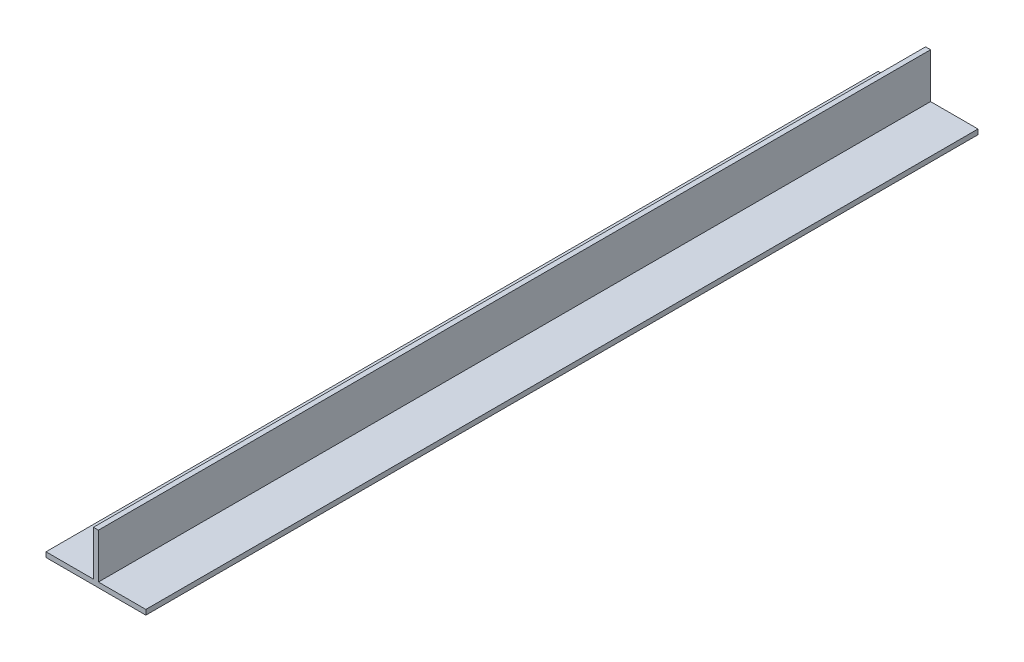
ISO-10303-21;
HEADER;
FILE_DESCRIPTION(('STEP AP214'),'2;1');
FILE_NAME('part.step','',(''),(''),'','','');
FILE_SCHEMA(('AUTOMOTIVE_DESIGN { 1 0 10303 214 1 1 1 1 }'));
ENDSEC;
DATA;
#1=APPLICATION_CONTEXT('core data for automotive mechanical design processes');
#2=APPLICATION_PROTOCOL_DEFINITION('international standard','automotive_design',2000,#1);
#3=PRODUCT_CONTEXT('',#1,'mechanical');
#4=PRODUCT('Part','Part','',(#3));
#5=PRODUCT_RELATED_PRODUCT_CATEGORY('part','',(#4));
#6=PRODUCT_DEFINITION_FORMATION('','',#4);
#7=PRODUCT_DEFINITION_CONTEXT('part definition',#1,'design');
#8=PRODUCT_DEFINITION('design','',#6,#7);
#9=PRODUCT_DEFINITION_SHAPE('','',#8);
#10=(LENGTH_UNIT() NAMED_UNIT(*) SI_UNIT(.MILLI.,.METRE.));
#11=(NAMED_UNIT(*) PLANE_ANGLE_UNIT() SI_UNIT($,.RADIAN.));
#12=(NAMED_UNIT(*) SI_UNIT($,.STERADIAN.) SOLID_ANGLE_UNIT());
#13=UNCERTAINTY_MEASURE_WITH_UNIT(LENGTH_MEASURE(1.E-05),#10,'distance_accuracy_value','');
#14=(GEOMETRIC_REPRESENTATION_CONTEXT(3) GLOBAL_UNCERTAINTY_ASSIGNED_CONTEXT((#13)) GLOBAL_UNIT_ASSIGNED_CONTEXT((#10,
#11,#12)) REPRESENTATION_CONTEXT('',''));
#15=CARTESIAN_POINT('',(0.,0.,0.));
#16=DIRECTION('',(0.,0.,1.));
#17=DIRECTION('',(1.,0.,0.));
#18=AXIS2_PLACEMENT_3D('',#15,#16,#17);
#19=CARTESIAN_POINT('',(0.,3.,500.));
#20=DIRECTION('',(1.,0.,0.));
#21=DIRECTION('',(0.,1.,0.));
#22=AXIS2_PLACEMENT_3D('',#19,#20,#21);
#23=PLANE('',#22);
#24=DIRECTION('',(0.,-1.,0.));
#25=VECTOR('',#24,1.);
#26=CARTESIAN_POINT('',(0.,3.,0.));
#27=LINE('',#26,#25);
#28=CARTESIAN_POINT('',(0.,3.,0.));
#29=VERTEX_POINT('',#28);
#30=CARTESIAN_POINT('',(0.,0.,0.));
#31=VERTEX_POINT('',#30);
#32=EDGE_CURVE('E131',#29,#31,#27,.T.);
#33=ORIENTED_EDGE('',*,*,#32,.T.);
#34=DIRECTION('',(0.,0.,-1.));
#35=VECTOR('',#34,1.);
#36=CARTESIAN_POINT('',(0.,0.,500.));
#37=LINE('',#36,#35);
#38=CARTESIAN_POINT('',(0.,0.,500.));
#39=VERTEX_POINT('',#38);
#40=EDGE_CURVE('E11',#39,#31,#37,.T.);
#41=ORIENTED_EDGE('',*,*,#40,.F.);
#42=DIRECTION('',(0.,-1.,0.));
#43=VECTOR('',#42,1.);
#44=CARTESIAN_POINT('',(0.,3.,500.));
#45=LINE('',#44,#43);
#46=CARTESIAN_POINT('',(0.,3.,500.));
#47=VERTEX_POINT('',#46);
#48=EDGE_CURVE('E145',#47,#39,#45,.T.);
#49=ORIENTED_EDGE('',*,*,#48,.F.);
#50=DIRECTION('',(0.,0.,-1.));
#51=VECTOR('',#50,1.);
#52=CARTESIAN_POINT('',(0.,3.,500.));
#53=LINE('',#52,#51);
#54=EDGE_CURVE('E127',#47,#29,#53,.T.);
#55=ORIENTED_EDGE('',*,*,#54,.T.);
#56=EDGE_LOOP('',(#33,#41,#49,#55));
#57=FACE_BOUND('',#56,.T.);
#58=ADVANCED_FACE('F35',(#57),#23,.F.);
#59=CARTESIAN_POINT('',(0.,0.,500.));
#60=DIRECTION('',(0.,1.,0.));
#61=DIRECTION('',(0.,0.,1.));
#62=AXIS2_PLACEMENT_3D('',#59,#60,#61);
#63=PLANE('',#62);
#64=DIRECTION('',(1.,0.,0.));
#65=VECTOR('',#64,1.);
#66=CARTESIAN_POINT('',(0.,0.,0.));
#67=LINE('',#66,#65);
#68=CARTESIAN_POINT('',(60.,0.,0.));
#69=VERTEX_POINT('',#68);
#70=EDGE_CURVE('E134',#31,#69,#67,.T.);
#71=ORIENTED_EDGE('',*,*,#70,.T.);
#72=DIRECTION('',(0.,0.,-1.));
#73=VECTOR('',#72,1.);
#74=CARTESIAN_POINT('',(60.,0.,500.));
#75=LINE('',#74,#73);
#76=CARTESIAN_POINT('',(60.,0.,500.));
#77=VERTEX_POINT('',#76);
#78=EDGE_CURVE('E43',#77,#69,#75,.T.);
#79=ORIENTED_EDGE('',*,*,#78,.F.);
#80=DIRECTION('',(1.,0.,0.));
#81=VECTOR('',#80,1.);
#82=CARTESIAN_POINT('',(0.,0.,500.));
#83=LINE('',#82,#81);
#84=EDGE_CURVE('E94',#39,#77,#83,.T.);
#85=ORIENTED_EDGE('',*,*,#84,.F.);
#86=ORIENTED_EDGE('',*,*,#40,.T.);
#87=EDGE_LOOP('',(#71,#79,#85,#86));
#88=FACE_BOUND('',#87,.T.);
#89=ADVANCED_FACE('F180',(#88),#63,.F.);
#90=CARTESIAN_POINT('',(60.,0.,500.));
#91=DIRECTION('',(-1.,0.,0.));
#92=DIRECTION('',(0.,0.,1.));
#93=AXIS2_PLACEMENT_3D('',#90,#91,#92);
#94=PLANE('',#93);
#95=DIRECTION('',(0.,1.,0.));
#96=VECTOR('',#95,1.);
#97=CARTESIAN_POINT('',(60.,0.,0.));
#98=LINE('',#97,#96);
#99=CARTESIAN_POINT('',(60.,3.,0.));
#100=VERTEX_POINT('',#99);
#101=EDGE_CURVE('E136',#69,#100,#98,.T.);
#102=ORIENTED_EDGE('',*,*,#101,.T.);
#103=DIRECTION('',(0.,0.,-1.));
#104=VECTOR('',#103,1.);
#105=CARTESIAN_POINT('',(60.,3.,500.));
#106=LINE('',#105,#104);
#107=CARTESIAN_POINT('',(60.,3.,500.));
#108=VERTEX_POINT('',#107);
#109=EDGE_CURVE('E152',#108,#100,#106,.T.);
#110=ORIENTED_EDGE('',*,*,#109,.F.);
#111=DIRECTION('',(0.,1.,0.));
#112=VECTOR('',#111,1.);
#113=CARTESIAN_POINT('',(60.,0.,500.));
#114=LINE('',#113,#112);
#115=EDGE_CURVE('E160',#77,#108,#114,.T.);
#116=ORIENTED_EDGE('',*,*,#115,.F.);
#117=ORIENTED_EDGE('',*,*,#78,.T.);
#118=EDGE_LOOP('',(#102,#110,#116,#117));
#119=FACE_BOUND('',#118,.T.);
#120=ADVANCED_FACE('F158',(#119),#94,.F.);
#121=CARTESIAN_POINT('',(60.,3.,500.));
#122=DIRECTION('',(0.,-1.,0.));
#123=DIRECTION('',(1.,0.,0.));
#124=AXIS2_PLACEMENT_3D('',#121,#122,#123);
#125=PLANE('',#124);
#126=DIRECTION('',(-1.,0.,0.));
#127=VECTOR('',#126,1.);
#128=CARTESIAN_POINT('',(60.,3.,0.));
#129=LINE('',#128,#127);
#130=CARTESIAN_POINT('',(31.5,3.,0.));
#131=VERTEX_POINT('',#130);
#132=EDGE_CURVE('E138',#100,#131,#129,.T.);
#133=ORIENTED_EDGE('',*,*,#132,.T.);
#134=DIRECTION('',(0.,0.,-1.));
#135=VECTOR('',#134,1.);
#136=CARTESIAN_POINT('',(31.5,3.,500.));
#137=LINE('',#136,#135);
#138=CARTESIAN_POINT('',(31.5,3.,500.));
#139=VERTEX_POINT('',#138);
#140=EDGE_CURVE('E149',#139,#131,#137,.T.);
#141=ORIENTED_EDGE('',*,*,#140,.F.);
#142=DIRECTION('',(-1.,0.,0.));
#143=VECTOR('',#142,1.);
#144=CARTESIAN_POINT('',(60.,3.,500.));
#145=LINE('',#144,#143);
#146=EDGE_CURVE('E172',#108,#139,#145,.T.);
#147=ORIENTED_EDGE('',*,*,#146,.F.);
#148=ORIENTED_EDGE('',*,*,#109,.T.);
#149=EDGE_LOOP('',(#133,#141,#147,#148));
#150=FACE_BOUND('',#149,.T.);
#151=ADVANCED_FACE('F168',(#150),#125,.F.);
#152=CARTESIAN_POINT('',(31.5,3.,500.));
#153=DIRECTION('',(-1.,0.,0.));
#154=DIRECTION('',(0.,0.,1.));
#155=AXIS2_PLACEMENT_3D('',#152,#153,#154);
#156=PLANE('',#155);
#157=DIRECTION('',(0.,1.,0.));
#158=VECTOR('',#157,1.);
#159=CARTESIAN_POINT('',(31.5,3.,0.));
#160=LINE('',#159,#158);
#161=CARTESIAN_POINT('',(31.5,30.,0.));
#162=VERTEX_POINT('',#161);
#163=EDGE_CURVE('E140',#131,#162,#160,.T.);
#164=ORIENTED_EDGE('',*,*,#163,.T.);
#165=DIRECTION('',(0.,0.,-1.));
#166=VECTOR('',#165,1.);
#167=CARTESIAN_POINT('',(31.5,30.,500.));
#168=LINE('',#167,#166);
#169=CARTESIAN_POINT('',(31.5,30.,500.));
#170=VERTEX_POINT('',#169);
#171=EDGE_CURVE('E122',#170,#162,#168,.T.);
#172=ORIENTED_EDGE('',*,*,#171,.F.);
#173=DIRECTION('',(0.,1.,0.));
#174=VECTOR('',#173,1.);
#175=CARTESIAN_POINT('',(31.5,3.,500.));
#176=LINE('',#175,#174);
#177=EDGE_CURVE('E113',#139,#170,#176,.T.);
#178=ORIENTED_EDGE('',*,*,#177,.F.);
#179=ORIENTED_EDGE('',*,*,#140,.T.);
#180=EDGE_LOOP('',(#164,#172,#178,#179));
#181=FACE_BOUND('',#180,.T.);
#182=ADVANCED_FACE('F171',(#181),#156,.F.);
#183=CARTESIAN_POINT('',(31.5,30.,500.));
#184=DIRECTION('',(0.,-1.,0.));
#185=DIRECTION('',(1.,0.,0.));
#186=AXIS2_PLACEMENT_3D('',#183,#184,#185);
#187=PLANE('',#186);
#188=DIRECTION('',(-1.,0.,0.));
#189=VECTOR('',#188,1.);
#190=CARTESIAN_POINT('',(31.5,30.,0.));
#191=LINE('',#190,#189);
#192=CARTESIAN_POINT('',(28.5,30.,0.));
#193=VERTEX_POINT('',#192);
#194=EDGE_CURVE('E121',#162,#193,#191,.T.);
#195=ORIENTED_EDGE('',*,*,#194,.T.);
#196=DIRECTION('',(0.,0.,-1.));
#197=VECTOR('',#196,1.);
#198=CARTESIAN_POINT('',(28.5,30.,500.));
#199=LINE('',#198,#197);
#200=CARTESIAN_POINT('',(28.5,30.,500.));
#201=VERTEX_POINT('',#200);
#202=EDGE_CURVE('E118',#201,#193,#199,.T.);
#203=ORIENTED_EDGE('',*,*,#202,.F.);
#204=DIRECTION('',(-1.,0.,0.));
#205=VECTOR('',#204,1.);
#206=CARTESIAN_POINT('',(31.5,30.,500.));
#207=LINE('',#206,#205);
#208=EDGE_CURVE('E107',#170,#201,#207,.T.);
#209=ORIENTED_EDGE('',*,*,#208,.F.);
#210=ORIENTED_EDGE('',*,*,#171,.T.);
#211=EDGE_LOOP('',(#195,#203,#209,#210));
#212=FACE_BOUND('',#211,.T.);
#213=ADVANCED_FACE('F119',(#212),#187,.F.);
#214=CARTESIAN_POINT('',(28.5,30.,500.));
#215=DIRECTION('',(1.,0.,0.));
#216=DIRECTION('',(0.,1.,0.));
#217=AXIS2_PLACEMENT_3D('',#214,#215,#216);
#218=PLANE('',#217);
#219=DIRECTION('',(0.,-1.,0.));
#220=VECTOR('',#219,1.);
#221=CARTESIAN_POINT('',(28.5,30.,0.));
#222=LINE('',#221,#220);
#223=CARTESIAN_POINT('',(28.5,3.,0.));
#224=VERTEX_POINT('',#223);
#225=EDGE_CURVE('E80',#193,#224,#222,.T.);
#226=ORIENTED_EDGE('',*,*,#225,.T.);
#227=DIRECTION('',(0.,0.,-1.));
#228=VECTOR('',#227,1.);
#229=CARTESIAN_POINT('',(28.5,3.,500.));
#230=LINE('',#229,#228);
#231=CARTESIAN_POINT('',(28.5,3.,500.));
#232=VERTEX_POINT('',#231);
#233=EDGE_CURVE('E123',#232,#224,#230,.T.);
#234=ORIENTED_EDGE('',*,*,#233,.F.);
#235=DIRECTION('',(0.,-1.,0.));
#236=VECTOR('',#235,1.);
#237=CARTESIAN_POINT('',(28.5,30.,500.));
#238=LINE('',#237,#236);
#239=EDGE_CURVE('E111',#201,#232,#238,.T.);
#240=ORIENTED_EDGE('',*,*,#239,.F.);
#241=ORIENTED_EDGE('',*,*,#202,.T.);
#242=EDGE_LOOP('',(#226,#234,#240,#241));
#243=FACE_BOUND('',#242,.T.);
#244=ADVANCED_FACE('F125',(#243),#218,.F.);
#245=CARTESIAN_POINT('',(28.5,3.,500.));
#246=DIRECTION('',(0.,-1.,0.));
#247=DIRECTION('',(1.,0.,0.));
#248=AXIS2_PLACEMENT_3D('',#245,#246,#247);
#249=PLANE('',#248);
#250=DIRECTION('',(-1.,0.,0.));
#251=VECTOR('',#250,1.);
#252=CARTESIAN_POINT('',(28.5,3.,0.));
#253=LINE('',#252,#251);
#254=EDGE_CURVE('E86',#224,#29,#253,.T.);
#255=ORIENTED_EDGE('',*,*,#254,.T.);
#256=ORIENTED_EDGE('',*,*,#54,.F.);
#257=DIRECTION('',(-1.,0.,0.));
#258=VECTOR('',#257,1.);
#259=CARTESIAN_POINT('',(28.5,3.,500.));
#260=LINE('',#259,#258);
#261=EDGE_CURVE('E51',#232,#47,#260,.T.);
#262=ORIENTED_EDGE('',*,*,#261,.F.);
#263=ORIENTED_EDGE('',*,*,#233,.T.);
#264=EDGE_LOOP('',(#255,#256,#262,#263));
#265=FACE_BOUND('',#264,.T.);
#266=ADVANCED_FACE('F196',(#265),#249,.F.);
#267=CARTESIAN_POINT('',(0.,0.,500.));
#268=DIRECTION('',(0.,0.,1.));
#269=DIRECTION('',(1.,0.,0.));
#270=AXIS2_PLACEMENT_3D('',#267,#268,#269);
#271=PLANE('',#270);
#272=ORIENTED_EDGE('',*,*,#48,.T.);
#273=ORIENTED_EDGE('',*,*,#84,.T.);
#274=ORIENTED_EDGE('',*,*,#115,.T.);
#275=ORIENTED_EDGE('',*,*,#146,.T.);
#276=ORIENTED_EDGE('',*,*,#177,.T.);
#277=ORIENTED_EDGE('',*,*,#208,.T.);
#278=ORIENTED_EDGE('',*,*,#239,.T.);
#279=ORIENTED_EDGE('',*,*,#261,.T.);
#280=EDGE_LOOP('',(#272,#273,#274,#275,#276,#277,#278,#279));
#281=FACE_BOUND('',#280,.T.);
#282=ADVANCED_FACE('F109',(#281),#271,.T.);
#283=CARTESIAN_POINT('',(0.,0.,0.));
#284=DIRECTION('',(0.,0.,1.));
#285=DIRECTION('',(1.,0.,0.));
#286=AXIS2_PLACEMENT_3D('',#283,#284,#285);
#287=PLANE('',#286);
#288=ORIENTED_EDGE('',*,*,#32,.F.);
#289=ORIENTED_EDGE('',*,*,#254,.F.);
#290=ORIENTED_EDGE('',*,*,#225,.F.);
#291=ORIENTED_EDGE('',*,*,#194,.F.);
#292=ORIENTED_EDGE('',*,*,#163,.F.);
#293=ORIENTED_EDGE('',*,*,#132,.F.);
#294=ORIENTED_EDGE('',*,*,#101,.F.);
#295=ORIENTED_EDGE('',*,*,#70,.F.);
#296=EDGE_LOOP('',(#288,#289,#290,#291,#292,#293,#294,#295));
#297=FACE_BOUND('',#296,.T.);
#298=ADVANCED_FACE('F164',(#297),#287,.F.);
#299=CLOSED_SHELL('',(#58,#89,#120,#151,#182,#213,#244,#266,#282,#298));
#300=MANIFOLD_SOLID_BREP('B2',#299);
#301=ADVANCED_BREP_SHAPE_REPRESENTATION('',(#18,#300),#14);
#302=SHAPE_DEFINITION_REPRESENTATION(#9,#301);
ENDSEC;
END-ISO-10303-21;
